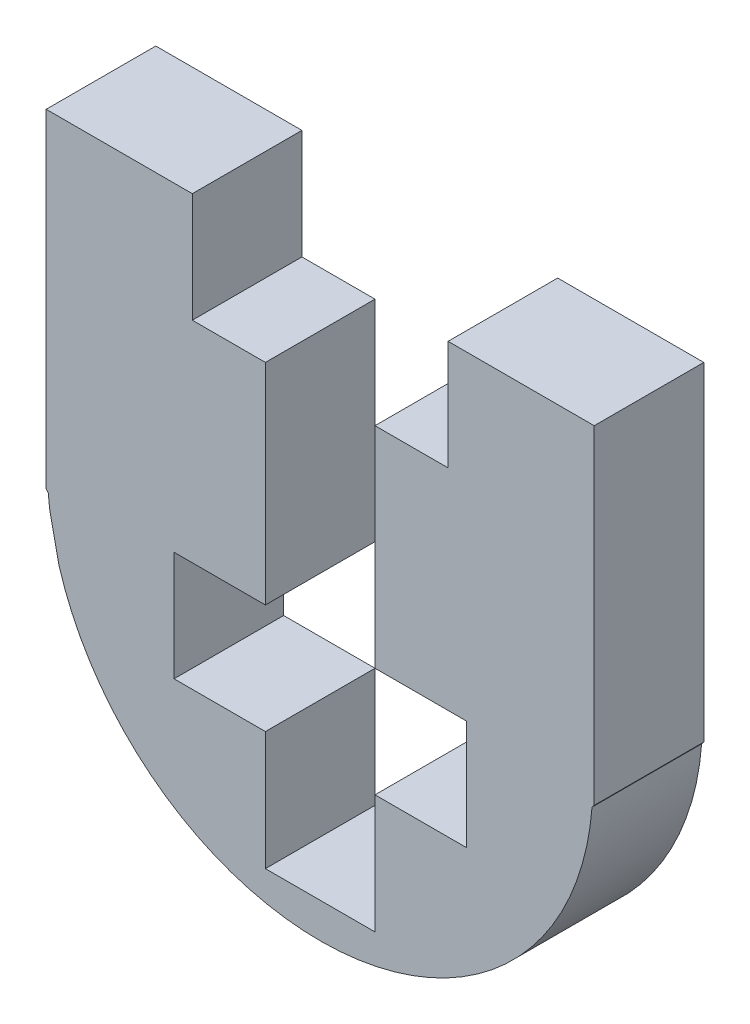
ISO-10303-21;
HEADER;
FILE_DESCRIPTION(('STEP AP214'),'2;1');
FILE_NAME('part.step','',(''),(''),'','','');
FILE_SCHEMA(('AUTOMOTIVE_DESIGN { 1 0 10303 214 1 1 1 1 }'));
ENDSEC;
DATA;
#1=APPLICATION_CONTEXT('core data for automotive mechanical design processes');
#2=APPLICATION_PROTOCOL_DEFINITION('international standard','automotive_design',2000,#1);
#3=PRODUCT_CONTEXT('',#1,'mechanical');
#4=PRODUCT('Part','Part','',(#3));
#5=PRODUCT_RELATED_PRODUCT_CATEGORY('part','',(#4));
#6=PRODUCT_DEFINITION_FORMATION('','',#4);
#7=PRODUCT_DEFINITION_CONTEXT('part definition',#1,'design');
#8=PRODUCT_DEFINITION('design','',#6,#7);
#9=PRODUCT_DEFINITION_SHAPE('','',#8);
#10=(LENGTH_UNIT() NAMED_UNIT(*) SI_UNIT(.MILLI.,.METRE.));
#11=(NAMED_UNIT(*) PLANE_ANGLE_UNIT() SI_UNIT($,.RADIAN.));
#12=(NAMED_UNIT(*) SI_UNIT($,.STERADIAN.) SOLID_ANGLE_UNIT());
#13=UNCERTAINTY_MEASURE_WITH_UNIT(LENGTH_MEASURE(1.E-05),#10,'distance_accuracy_value','');
#14=(GEOMETRIC_REPRESENTATION_CONTEXT(3) GLOBAL_UNCERTAINTY_ASSIGNED_CONTEXT((#13)) GLOBAL_UNIT_ASSIGNED_CONTEXT((#10,
#11,#12)) REPRESENTATION_CONTEXT('',''));
#15=CARTESIAN_POINT('',(0.,0.,0.));
#16=DIRECTION('',(0.,0.,1.));
#17=DIRECTION('',(1.,0.,0.));
#18=AXIS2_PLACEMENT_3D('',#15,#16,#17);
#19=CARTESIAN_POINT('',(-7.5,8.5,3.));
#20=DIRECTION('',(0.,-1.,0.));
#21=DIRECTION('',(1.,0.,0.));
#22=AXIS2_PLACEMENT_3D('',#19,#20,#21);
#23=PLANE('',#22);
#24=DIRECTION('',(-1.,0.,0.));
#25=VECTOR('',#24,1.);
#26=CARTESIAN_POINT('',(-7.5,8.5,3.));
#27=LINE('',#26,#25);
#28=CARTESIAN_POINT('',(-3.5,8.5,3.));
#29=VERTEX_POINT('',#28);
#30=CARTESIAN_POINT('',(-7.5,8.5,3.));
#31=VERTEX_POINT('',#30);
#32=EDGE_CURVE('E427',#29,#31,#27,.T.);
#33=ORIENTED_EDGE('',*,*,#32,.F.);
#34=DIRECTION('',(0.,0.,1.));
#35=VECTOR('',#34,1.);
#36=CARTESIAN_POINT('',(-3.5,8.5,-7.));
#37=LINE('',#36,#35);
#38=CARTESIAN_POINT('',(-3.5,8.5,0.));
#39=VERTEX_POINT('',#38);
#40=EDGE_CURVE('E359',#39,#29,#37,.T.);
#41=ORIENTED_EDGE('',*,*,#40,.F.);
#42=DIRECTION('',(-1.,0.,0.));
#43=VECTOR('',#42,1.);
#44=CARTESIAN_POINT('',(-7.5,8.5,0.));
#45=LINE('',#44,#43);
#46=CARTESIAN_POINT('',(-7.5,8.5,0.));
#47=VERTEX_POINT('',#46);
#48=EDGE_CURVE('E266',#39,#47,#45,.T.);
#49=ORIENTED_EDGE('',*,*,#48,.T.);
#50=DIRECTION('',(0.,0.,-1.));
#51=VECTOR('',#50,1.);
#52=CARTESIAN_POINT('',(-7.5,8.5,3.));
#53=LINE('',#52,#51);
#54=EDGE_CURVE('E278',#31,#47,#53,.T.);
#55=ORIENTED_EDGE('',*,*,#54,.F.);
#56=EDGE_LOOP('',(#33,#41,#49,#55));
#57=FACE_BOUND('',#56,.T.);
#58=ADVANCED_FACE('F67',(#57),#23,.F.);
#59=CARTESIAN_POINT('',(7.5,-0.500000000000001,3.));
#60=DIRECTION('',(-1.,0.,0.));
#61=DIRECTION('',(0.,-1.,0.));
#62=AXIS2_PLACEMENT_3D('',#59,#60,#61);
#63=PLANE('',#62);
#64=DIRECTION('',(0.,1.,0.));
#65=VECTOR('',#64,1.);
#66=CARTESIAN_POINT('',(7.5,-0.500000000000001,0.));
#67=LINE('',#66,#65);
#68=CARTESIAN_POINT('',(7.5,-0.500000000000001,0.));
#69=VERTEX_POINT('',#68);
#70=CARTESIAN_POINT('',(7.5,8.50000000000001,0.));
#71=VERTEX_POINT('',#70);
#72=EDGE_CURVE('E263',#69,#71,#67,.T.);
#73=ORIENTED_EDGE('',*,*,#72,.T.);
#74=DIRECTION('',(0.,0.,-1.));
#75=VECTOR('',#74,1.);
#76=CARTESIAN_POINT('',(7.5,8.50000000000001,3.));
#77=LINE('',#76,#75);
#78=CARTESIAN_POINT('',(7.5,8.50000000000001,3.));
#79=VERTEX_POINT('',#78);
#80=EDGE_CURVE('E281',#79,#71,#77,.T.);
#81=ORIENTED_EDGE('',*,*,#80,.F.);
#82=DIRECTION('',(0.,1.,0.));
#83=VECTOR('',#82,1.);
#84=CARTESIAN_POINT('',(7.5,-0.500000000000001,3.));
#85=LINE('',#84,#83);
#86=CARTESIAN_POINT('',(7.5,-0.500000000000001,3.));
#87=VERTEX_POINT('',#86);
#88=EDGE_CURVE('E275',#87,#79,#85,.T.);
#89=ORIENTED_EDGE('',*,*,#88,.F.);
#90=DIRECTION('',(0.,0.,-1.));
#91=VECTOR('',#90,1.);
#92=CARTESIAN_POINT('',(7.5,-0.500000000000001,3.));
#93=LINE('',#92,#91);
#94=EDGE_CURVE('E253',#87,#69,#93,.T.);
#95=ORIENTED_EDGE('',*,*,#94,.T.);
#96=EDGE_LOOP('',(#73,#81,#89,#95));
#97=FACE_BOUND('',#96,.T.);
#98=ADVANCED_FACE('F69',(#97),#63,.F.);
#99=CARTESIAN_POINT('',(3.5,8.5,0.));
#100=VERTEX_POINT('',#99);
#101=EDGE_CURVE('E268',#71,#100,#45,.T.);
#102=ORIENTED_EDGE('',*,*,#101,.T.);
#103=DIRECTION('',(0.,0.,1.));
#104=VECTOR('',#103,1.);
#105=CARTESIAN_POINT('',(3.5,8.5,-7.));
#106=LINE('',#105,#104);
#107=CARTESIAN_POINT('',(3.5,8.5,3.));
#108=VERTEX_POINT('',#107);
#109=EDGE_CURVE('E332',#100,#108,#106,.T.);
#110=ORIENTED_EDGE('',*,*,#109,.T.);
#111=EDGE_CURVE('E335',#79,#108,#27,.T.);
#112=ORIENTED_EDGE('',*,*,#111,.F.);
#113=ORIENTED_EDGE('',*,*,#80,.T.);
#114=EDGE_LOOP('',(#102,#110,#112,#113));
#115=FACE_BOUND('',#114,.T.);
#116=ADVANCED_FACE('F331',(#115),#23,.F.);
#117=CARTESIAN_POINT('',(-7.5,-0.500000000000001,3.));
#118=DIRECTION('',(1.,0.,0.));
#119=DIRECTION('',(0.,0.,-1.));
#120=AXIS2_PLACEMENT_3D('',#117,#118,#119);
#121=PLANE('',#120);
#122=DIRECTION('',(0.,-1.,0.));
#123=VECTOR('',#122,1.);
#124=CARTESIAN_POINT('',(-7.5,-0.500000000000001,0.));
#125=LINE('',#124,#123);
#126=CARTESIAN_POINT('',(-7.5,-0.500000000000001,0.));
#127=VERTEX_POINT('',#126);
#128=EDGE_CURVE('E271',#47,#127,#125,.T.);
#129=ORIENTED_EDGE('',*,*,#128,.T.);
#130=DIRECTION('',(0.,0.,-1.));
#131=VECTOR('',#130,1.);
#132=CARTESIAN_POINT('',(-7.5,-0.500000000000001,3.));
#133=LINE('',#132,#131);
#134=CARTESIAN_POINT('',(-7.5,-0.500000000000001,3.));
#135=VERTEX_POINT('',#134);
#136=EDGE_CURVE('E257',#135,#127,#133,.T.);
#137=ORIENTED_EDGE('',*,*,#136,.F.);
#138=DIRECTION('',(0.,-1.,0.));
#139=VECTOR('',#138,1.);
#140=CARTESIAN_POINT('',(-7.5,-0.500000000000001,3.));
#141=LINE('',#140,#139);
#142=EDGE_CURVE('E259',#31,#135,#141,.T.);
#143=ORIENTED_EDGE('',*,*,#142,.F.);
#144=ORIENTED_EDGE('',*,*,#54,.T.);
#145=EDGE_LOOP('',(#129,#137,#143,#144));
#146=FACE_BOUND('',#145,.T.);
#147=ADVANCED_FACE('F435',(#146),#121,.F.);
#148=CARTESIAN_POINT('',(-5.,-3.5,3.));
#149=DIRECTION('',(0.768221279597376,0.64018439966448,0.));
#150=DIRECTION('',(-0.64018439966448,0.768221279597376,0.));
#151=AXIS2_PLACEMENT_3D('',#148,#149,#150);
#152=PLANE('',#151);
#153=DIRECTION('',(0.64018439966448,-0.768221279597376,0.));
#154=VECTOR('',#153,1.);
#155=CARTESIAN_POINT('',(-5.,-3.5,0.));
#156=LINE('',#155,#154);
#157=CARTESIAN_POINT('',(-7.44050244554594,-0.571397065344873,0.));
#158=VERTEX_POINT('',#157);
#159=EDGE_CURVE('E87',#127,#158,#156,.T.);
#160=ORIENTED_EDGE('',*,*,#159,.T.);
#161=DIRECTION('',(0.,0.,1.));
#162=VECTOR('',#161,1.);
#163=CARTESIAN_POINT('',(-7.44050244554594,-0.571397065344871,0.));
#164=LINE('',#163,#162);
#165=CARTESIAN_POINT('',(-7.44050244554594,-0.571397065344873,3.));
#166=VERTEX_POINT('',#165);
#167=EDGE_CURVE('E82',#158,#166,#164,.T.);
#168=ORIENTED_EDGE('',*,*,#167,.T.);
#169=DIRECTION('',(0.64018439966448,-0.768221279597376,0.));
#170=VECTOR('',#169,1.);
#171=CARTESIAN_POINT('',(-5.,-3.5,3.));
#172=LINE('',#171,#170);
#173=EDGE_CURVE('E255',#135,#166,#172,.T.);
#174=ORIENTED_EDGE('',*,*,#173,.F.);
#175=ORIENTED_EDGE('',*,*,#136,.T.);
#176=EDGE_LOOP('',(#160,#168,#174,#175));
#177=FACE_BOUND('',#176,.T.);
#178=ADVANCED_FACE('F437',(#177),#152,.F.);
#179=CARTESIAN_POINT('',(5.,-3.5,3.));
#180=DIRECTION('',(-0.768221279597376,0.640184399664479,0.));
#181=DIRECTION('',(-0.640184399664479,-0.768221279597376,0.));
#182=AXIS2_PLACEMENT_3D('',#179,#180,#181);
#183=PLANE('',#182);
#184=DIRECTION('',(0.640184399664479,0.768221279597376,0.));
#185=VECTOR('',#184,1.);
#186=CARTESIAN_POINT('',(5.,-3.5,3.));
#187=LINE('',#186,#185);
#188=CARTESIAN_POINT('',(7.44050244554594,-0.571397065344866,3.));
#189=VERTEX_POINT('',#188);
#190=EDGE_CURVE('E234',#189,#87,#187,.T.);
#191=ORIENTED_EDGE('',*,*,#190,.F.);
#192=DIRECTION('',(0.,0.,1.));
#193=VECTOR('',#192,1.);
#194=CARTESIAN_POINT('',(7.44050244554594,-0.571397065344866,0.));
#195=LINE('',#194,#193);
#196=CARTESIAN_POINT('',(7.44050244554594,-0.571397065344866,0.));
#197=VERTEX_POINT('',#196);
#198=EDGE_CURVE('E244',#197,#189,#195,.T.);
#199=ORIENTED_EDGE('',*,*,#198,.F.);
#200=DIRECTION('',(0.640184399664479,0.768221279597376,0.));
#201=VECTOR('',#200,1.);
#202=CARTESIAN_POINT('',(5.,-3.5,0.));
#203=LINE('',#202,#201);
#204=EDGE_CURVE('E274',#197,#69,#203,.T.);
#205=ORIENTED_EDGE('',*,*,#204,.T.);
#206=ORIENTED_EDGE('',*,*,#94,.F.);
#207=EDGE_LOOP('',(#191,#199,#205,#206));
#208=FACE_BOUND('',#207,.T.);
#209=ADVANCED_FACE('F251',(#208),#183,.F.);
#210=CARTESIAN_POINT('',(0.,-4.46241055212455,3.));
#211=DIRECTION('',(0.,0.,1.));
#212=DIRECTION('',(1.,0.,0.));
#213=AXIS2_PLACEMENT_3D('',#210,#211,#212);
#214=PLANE('',#213);
#215=DIRECTION('',(1.,0.,0.));
#216=VECTOR('',#215,1.);
#217=CARTESIAN_POINT('',(-1.5,5.5,3.));
#218=LINE('',#217,#216);
#219=CARTESIAN_POINT('',(-3.5,5.5,3.));
#220=VERTEX_POINT('',#219);
#221=CARTESIAN_POINT('',(-1.5,5.5,3.));
#222=VERTEX_POINT('',#221);
#223=EDGE_CURVE('E357',#220,#222,#218,.T.);
#224=ORIENTED_EDGE('',*,*,#223,.F.);
#225=DIRECTION('',(0.,-1.,0.));
#226=VECTOR('',#225,1.);
#227=CARTESIAN_POINT('',(-3.5,8.5,3.));
#228=LINE('',#227,#226);
#229=EDGE_CURVE('E354',#29,#220,#228,.T.);
#230=ORIENTED_EDGE('',*,*,#229,.F.);
#231=ORIENTED_EDGE('',*,*,#32,.T.);
#232=ORIENTED_EDGE('',*,*,#142,.T.);
#233=ORIENTED_EDGE('',*,*,#173,.T.);
#234=CARTESIAN_POINT('',(0.,0.,3.));
#235=DIRECTION('',(0.,0.,1.));
#236=DIRECTION('',(1.,0.,0.));
#237=AXIS2_PLACEMENT_3D('',#234,#235,#236);
#238=CIRCLE('',#237,7.46241055212455);
#239=CARTESIAN_POINT('',(-7.3989350896553,-0.971252175043861,3.));
#240=VERTEX_POINT('',#239);
#241=EDGE_CURVE('E242',#166,#240,#238,.T.);
#242=ORIENTED_EDGE('',*,*,#241,.T.);
#243=DIRECTION('',(0.209692350271931,-0.977767415205392,0.));
#244=VECTOR('',#243,1.);
#245=CARTESIAN_POINT('',(-7.27273356043762,-1.55971304573425,3.));
#246=LINE('',#245,#244);
#247=CARTESIAN_POINT('',(-7.14653203121994,-2.14817391642467,3.));
#248=VERTEX_POINT('',#247);
#249=EDGE_CURVE('E238',#240,#248,#246,.T.);
#250=ORIENTED_EDGE('',*,*,#249,.T.);
#251=EDGE_CURVE('E228',#248,#189,#238,.T.);
#252=ORIENTED_EDGE('',*,*,#251,.T.);
#253=ORIENTED_EDGE('',*,*,#190,.T.);
#254=ORIENTED_EDGE('',*,*,#88,.T.);
#255=ORIENTED_EDGE('',*,*,#111,.T.);
#256=DIRECTION('',(0.,1.,0.));
#257=VECTOR('',#256,1.);
#258=CARTESIAN_POINT('',(3.5,8.5,3.));
#259=LINE('',#258,#257);
#260=CARTESIAN_POINT('',(3.5,5.5,3.));
#261=VERTEX_POINT('',#260);
#262=EDGE_CURVE('E365',#261,#108,#259,.T.);
#263=ORIENTED_EDGE('',*,*,#262,.F.);
#264=DIRECTION('',(1.,0.,0.));
#265=VECTOR('',#264,1.);
#266=CARTESIAN_POINT('',(1.5,5.5,3.));
#267=LINE('',#266,#265);
#268=CARTESIAN_POINT('',(1.5,5.5,3.));
#269=VERTEX_POINT('',#268);
#270=EDGE_CURVE('E351',#269,#261,#267,.T.);
#271=ORIENTED_EDGE('',*,*,#270,.F.);
#272=DIRECTION('',(0.,1.,0.));
#273=VECTOR('',#272,1.);
#274=CARTESIAN_POINT('',(1.5,8.5,3.));
#275=LINE('',#274,#273);
#276=CARTESIAN_POINT('',(1.5,-0.249999999999999,3.));
#277=VERTEX_POINT('',#276);
#278=EDGE_CURVE('E386',#277,#269,#275,.T.);
#279=ORIENTED_EDGE('',*,*,#278,.F.);
#280=DIRECTION('',(-1.,0.,0.));
#281=VECTOR('',#280,1.);
#282=CARTESIAN_POINT('',(1.5,-0.249999999999999,3.));
#283=LINE('',#282,#281);
#284=CARTESIAN_POINT('',(4.,-0.249999999999998,3.));
#285=VERTEX_POINT('',#284);
#286=EDGE_CURVE('E383',#285,#277,#283,.T.);
#287=ORIENTED_EDGE('',*,*,#286,.F.);
#288=DIRECTION('',(0.,1.,0.));
#289=VECTOR('',#288,1.);
#290=CARTESIAN_POINT('',(4.,-0.249999999999998,3.));
#291=LINE('',#290,#289);
#292=CARTESIAN_POINT('',(4.,-3.25,3.));
#293=VERTEX_POINT('',#292);
#294=EDGE_CURVE('E380',#293,#285,#291,.T.);
#295=ORIENTED_EDGE('',*,*,#294,.F.);
#296=DIRECTION('',(1.,0.,0.));
#297=VECTOR('',#296,1.);
#298=CARTESIAN_POINT('',(4.,-3.25,3.));
#299=LINE('',#298,#297);
#300=CARTESIAN_POINT('',(1.5,-3.25,3.));
#301=VERTEX_POINT('',#300);
#302=EDGE_CURVE('E377',#301,#293,#299,.T.);
#303=ORIENTED_EDGE('',*,*,#302,.F.);
#304=DIRECTION('',(0.,1.,0.));
#305=VECTOR('',#304,1.);
#306=CARTESIAN_POINT('',(1.5,-3.25,3.));
#307=LINE('',#306,#305);
#308=CARTESIAN_POINT('',(1.5,-6.5,3.));
#309=VERTEX_POINT('',#308);
#310=EDGE_CURVE('E374',#309,#301,#307,.T.);
#311=ORIENTED_EDGE('',*,*,#310,.F.);
#312=DIRECTION('',(1.,0.,0.));
#313=VECTOR('',#312,1.);
#314=CARTESIAN_POINT('',(-1.5,-6.5,3.));
#315=LINE('',#314,#313);
#316=CARTESIAN_POINT('',(-1.5,-6.5,3.));
#317=VERTEX_POINT('',#316);
#318=EDGE_CURVE('E403',#317,#309,#315,.T.);
#319=ORIENTED_EDGE('',*,*,#318,.F.);
#320=DIRECTION('',(0.,-1.,0.));
#321=VECTOR('',#320,1.);
#322=CARTESIAN_POINT('',(-1.5,-3.25,3.));
#323=LINE('',#322,#321);
#324=CARTESIAN_POINT('',(-1.5,-3.25,3.));
#325=VERTEX_POINT('',#324);
#326=EDGE_CURVE('E400',#325,#317,#323,.T.);
#327=ORIENTED_EDGE('',*,*,#326,.F.);
#328=DIRECTION('',(1.,0.,0.));
#329=VECTOR('',#328,1.);
#330=CARTESIAN_POINT('',(-4.,-3.25,3.));
#331=LINE('',#330,#329);
#332=CARTESIAN_POINT('',(-4.,-3.25,3.));
#333=VERTEX_POINT('',#332);
#334=EDGE_CURVE('E397',#333,#325,#331,.T.);
#335=ORIENTED_EDGE('',*,*,#334,.F.);
#336=DIRECTION('',(0.,-1.,0.));
#337=VECTOR('',#336,1.);
#338=CARTESIAN_POINT('',(-4.,-0.249999999999999,3.));
#339=LINE('',#338,#337);
#340=CARTESIAN_POINT('',(-4.,-0.249999999999999,3.));
#341=VERTEX_POINT('',#340);
#342=EDGE_CURVE('E394',#341,#333,#339,.T.);
#343=ORIENTED_EDGE('',*,*,#342,.F.);
#344=DIRECTION('',(-1.,0.,0.));
#345=VECTOR('',#344,1.);
#346=CARTESIAN_POINT('',(-1.5,-0.249999999999999,3.));
#347=LINE('',#346,#345);
#348=CARTESIAN_POINT('',(-1.5,-0.249999999999999,3.));
#349=VERTEX_POINT('',#348);
#350=EDGE_CURVE('E391',#349,#341,#347,.T.);
#351=ORIENTED_EDGE('',*,*,#350,.F.);
#352=DIRECTION('',(0.,-1.,0.));
#353=VECTOR('',#352,1.);
#354=CARTESIAN_POINT('',(-1.5,8.5,3.));
#355=LINE('',#354,#353);
#356=EDGE_CURVE('E389',#222,#349,#355,.T.);
#357=ORIENTED_EDGE('',*,*,#356,.F.);
#358=EDGE_LOOP('',(#224,#230,#231,#232,#233,#242,#250,#252,#253,#254,#255,#263,#271,#279,#287,
#295,#303,#311,#319,#327,#335,#343,#351,#357));
#359=FACE_BOUND('',#358,.T.);
#360=ADVANCED_FACE('F231',(#359),#214,.T.);
#361=CARTESIAN_POINT('',(0.,-4.46241055212455,0.));
#362=DIRECTION('',(0.,0.,1.));
#363=DIRECTION('',(1.,0.,0.));
#364=AXIS2_PLACEMENT_3D('',#361,#362,#363);
#365=PLANE('',#364);
#366=DIRECTION('',(0.,-1.,0.));
#367=VECTOR('',#366,1.);
#368=CARTESIAN_POINT('',(-3.5,-4.46241055212455,0.));
#369=LINE('',#368,#367);
#370=CARTESIAN_POINT('',(-3.5,5.5,0.));
#371=VERTEX_POINT('',#370);
#372=EDGE_CURVE('E12',#39,#371,#369,.T.);
#373=ORIENTED_EDGE('',*,*,#372,.T.);
#374=DIRECTION('',(1.,0.,0.));
#375=VECTOR('',#374,1.);
#376=CARTESIAN_POINT('',(0.,5.5,0.));
#377=LINE('',#376,#375);
#378=CARTESIAN_POINT('',(-1.5,5.5,0.));
#379=VERTEX_POINT('',#378);
#380=EDGE_CURVE('E371',#371,#379,#377,.T.);
#381=ORIENTED_EDGE('',*,*,#380,.T.);
#382=DIRECTION('',(0.,-1.,0.));
#383=VECTOR('',#382,1.);
#384=CARTESIAN_POINT('',(-1.5,-4.46241055212455,0.));
#385=LINE('',#384,#383);
#386=CARTESIAN_POINT('',(-1.5,-0.249999999999999,0.));
#387=VERTEX_POINT('',#386);
#388=EDGE_CURVE('E314',#379,#387,#385,.T.);
#389=ORIENTED_EDGE('',*,*,#388,.T.);
#390=DIRECTION('',(-1.,0.,0.));
#391=VECTOR('',#390,1.);
#392=CARTESIAN_POINT('',(0.,-0.249999999999999,0.));
#393=LINE('',#392,#391);
#394=CARTESIAN_POINT('',(-4.,-0.249999999999999,0.));
#395=VERTEX_POINT('',#394);
#396=EDGE_CURVE('E311',#387,#395,#393,.T.);
#397=ORIENTED_EDGE('',*,*,#396,.T.);
#398=DIRECTION('',(0.,-1.,0.));
#399=VECTOR('',#398,1.);
#400=CARTESIAN_POINT('',(-4.,-4.46241055212455,0.));
#401=LINE('',#400,#399);
#402=CARTESIAN_POINT('',(-4.,-3.25,0.));
#403=VERTEX_POINT('',#402);
#404=EDGE_CURVE('E308',#395,#403,#401,.T.);
#405=ORIENTED_EDGE('',*,*,#404,.T.);
#406=DIRECTION('',(1.,0.,0.));
#407=VECTOR('',#406,1.);
#408=CARTESIAN_POINT('',(0.,-3.25,0.));
#409=LINE('',#408,#407);
#410=CARTESIAN_POINT('',(-1.5,-3.25,0.));
#411=VERTEX_POINT('',#410);
#412=EDGE_CURVE('E305',#403,#411,#409,.T.);
#413=ORIENTED_EDGE('',*,*,#412,.T.);
#414=DIRECTION('',(0.,-1.,0.));
#415=VECTOR('',#414,1.);
#416=CARTESIAN_POINT('',(-1.5,-4.46241055212455,0.));
#417=LINE('',#416,#415);
#418=CARTESIAN_POINT('',(-1.5,-6.5,0.));
#419=VERTEX_POINT('',#418);
#420=EDGE_CURVE('E302',#411,#419,#417,.T.);
#421=ORIENTED_EDGE('',*,*,#420,.T.);
#422=DIRECTION('',(1.,0.,0.));
#423=VECTOR('',#422,1.);
#424=CARTESIAN_POINT('',(0.,-6.5,0.));
#425=LINE('',#424,#423);
#426=CARTESIAN_POINT('',(1.5,-6.5,0.));
#427=VERTEX_POINT('',#426);
#428=EDGE_CURVE('E299',#419,#427,#425,.T.);
#429=ORIENTED_EDGE('',*,*,#428,.T.);
#430=DIRECTION('',(0.,1.,0.));
#431=VECTOR('',#430,1.);
#432=CARTESIAN_POINT('',(1.5,-4.46241055212455,0.));
#433=LINE('',#432,#431);
#434=CARTESIAN_POINT('',(1.5,-3.25,0.));
#435=VERTEX_POINT('',#434);
#436=EDGE_CURVE('E296',#427,#435,#433,.T.);
#437=ORIENTED_EDGE('',*,*,#436,.T.);
#438=DIRECTION('',(1.,0.,0.));
#439=VECTOR('',#438,1.);
#440=CARTESIAN_POINT('',(0.,-3.25,0.));
#441=LINE('',#440,#439);
#442=CARTESIAN_POINT('',(4.,-3.25,0.));
#443=VERTEX_POINT('',#442);
#444=EDGE_CURVE('E284',#435,#443,#441,.T.);
#445=ORIENTED_EDGE('',*,*,#444,.T.);
#446=DIRECTION('',(0.,1.,0.));
#447=VECTOR('',#446,1.);
#448=CARTESIAN_POINT('',(4.00000000000001,-4.46241055212455,0.));
#449=LINE('',#448,#447);
#450=CARTESIAN_POINT('',(4.,-0.249999999999998,0.));
#451=VERTEX_POINT('',#450);
#452=EDGE_CURVE('E287',#443,#451,#449,.T.);
#453=ORIENTED_EDGE('',*,*,#452,.T.);
#454=DIRECTION('',(-1.,0.,0.));
#455=VECTOR('',#454,1.);
#456=CARTESIAN_POINT('',(0.,-0.249999999999999,0.));
#457=LINE('',#456,#455);
#458=CARTESIAN_POINT('',(1.5,-0.249999999999999,0.));
#459=VERTEX_POINT('',#458);
#460=EDGE_CURVE('E290',#451,#459,#457,.T.);
#461=ORIENTED_EDGE('',*,*,#460,.T.);
#462=DIRECTION('',(0.,1.,0.));
#463=VECTOR('',#462,1.);
#464=CARTESIAN_POINT('',(1.5,-4.46241055212455,0.));
#465=LINE('',#464,#463);
#466=CARTESIAN_POINT('',(1.5,5.5,0.));
#467=VERTEX_POINT('',#466);
#468=EDGE_CURVE('E293',#459,#467,#465,.T.);
#469=ORIENTED_EDGE('',*,*,#468,.T.);
#470=DIRECTION('',(1.,0.,0.));
#471=VECTOR('',#470,1.);
#472=CARTESIAN_POINT('',(0.,5.5,0.));
#473=LINE('',#472,#471);
#474=CARTESIAN_POINT('',(3.5,5.5,0.));
#475=VERTEX_POINT('',#474);
#476=EDGE_CURVE('E326',#467,#475,#473,.T.);
#477=ORIENTED_EDGE('',*,*,#476,.T.);
#478=DIRECTION('',(0.,1.,0.));
#479=VECTOR('',#478,1.);
#480=CARTESIAN_POINT('',(3.5,-4.46241055212455,0.));
#481=LINE('',#480,#479);
#482=EDGE_CURVE('E75',#475,#100,#481,.T.);
#483=ORIENTED_EDGE('',*,*,#482,.T.);
#484=ORIENTED_EDGE('',*,*,#101,.F.);
#485=ORIENTED_EDGE('',*,*,#72,.F.);
#486=ORIENTED_EDGE('',*,*,#204,.F.);
#487=CARTESIAN_POINT('',(0.,0.,0.));
#488=DIRECTION('',(0.,0.,1.));
#489=DIRECTION('',(1.,0.,0.));
#490=AXIS2_PLACEMENT_3D('',#487,#488,#489);
#491=CIRCLE('',#490,7.46241055212455);
#492=CARTESIAN_POINT('',(-7.14653203121994,-2.14817391642467,0.));
#493=VERTEX_POINT('',#492);
#494=EDGE_CURVE('E247',#493,#197,#491,.T.);
#495=ORIENTED_EDGE('',*,*,#494,.F.);
#496=DIRECTION('',(0.209692350271931,-0.977767415205392,0.));
#497=VECTOR('',#496,1.);
#498=CARTESIAN_POINT('',(-7.27273356043762,-1.55971304573425,0.));
#499=LINE('',#498,#497);
#500=CARTESIAN_POINT('',(-7.3989350896553,-0.971252175043861,0.));
#501=VERTEX_POINT('',#500);
#502=EDGE_CURVE('E340',#501,#493,#499,.T.);
#503=ORIENTED_EDGE('',*,*,#502,.F.);
#504=EDGE_CURVE('E240',#158,#501,#491,.T.);
#505=ORIENTED_EDGE('',*,*,#504,.F.);
#506=ORIENTED_EDGE('',*,*,#159,.F.);
#507=ORIENTED_EDGE('',*,*,#128,.F.);
#508=ORIENTED_EDGE('',*,*,#48,.F.);
#509=EDGE_LOOP('',(#373,#381,#389,#397,#405,#413,#421,#429,#437,#445,#453,#461,#469,#477,#483,
#484,#485,#486,#495,#503,#505,#506,#507,#508));
#510=FACE_BOUND('',#509,.T.);
#511=ADVANCED_FACE('F324',(#510),#365,.F.);
#512=CARTESIAN_POINT('',(1.5,-3.25,-7.));
#513=DIRECTION('',(1.,0.,0.));
#514=DIRECTION('',(0.,1.,0.));
#515=AXIS2_PLACEMENT_3D('',#512,#513,#514);
#516=PLANE('',#515);
#517=DIRECTION('',(0.,0.,1.));
#518=VECTOR('',#517,1.);
#519=CARTESIAN_POINT('',(1.5,-6.5,-7.));
#520=LINE('',#519,#518);
#521=EDGE_CURVE('E267',#427,#309,#520,.T.);
#522=ORIENTED_EDGE('',*,*,#521,.T.);
#523=ORIENTED_EDGE('',*,*,#310,.T.);
#524=DIRECTION('',(0.,0.,1.));
#525=VECTOR('',#524,1.);
#526=CARTESIAN_POINT('',(1.5,-3.25,-7.));
#527=LINE('',#526,#525);
#528=EDGE_CURVE('E406',#435,#301,#527,.T.);
#529=ORIENTED_EDGE('',*,*,#528,.F.);
#530=ORIENTED_EDGE('',*,*,#436,.F.);
#531=EDGE_LOOP('',(#522,#523,#529,#530));
#532=FACE_BOUND('',#531,.T.);
#533=ADVANCED_FACE('F469',(#532),#516,.F.);
#534=CARTESIAN_POINT('',(-1.5,-6.5,-7.));
#535=DIRECTION('',(0.,-1.,0.));
#536=DIRECTION('',(0.,0.,-1.));
#537=AXIS2_PLACEMENT_3D('',#534,#535,#536);
#538=PLANE('',#537);
#539=DIRECTION('',(0.,0.,1.));
#540=VECTOR('',#539,1.);
#541=CARTESIAN_POINT('',(-1.5,-6.5,-7.));
#542=LINE('',#541,#540);
#543=EDGE_CURVE('E408',#419,#317,#542,.T.);
#544=ORIENTED_EDGE('',*,*,#543,.T.);
#545=ORIENTED_EDGE('',*,*,#318,.T.);
#546=ORIENTED_EDGE('',*,*,#521,.F.);
#547=ORIENTED_EDGE('',*,*,#428,.F.);
#548=EDGE_LOOP('',(#544,#545,#546,#547));
#549=FACE_BOUND('',#548,.T.);
#550=ADVANCED_FACE('F474',(#549),#538,.F.);
#551=CARTESIAN_POINT('',(-1.5,-3.25,-7.));
#552=DIRECTION('',(-1.,0.,0.));
#553=DIRECTION('',(0.,-1.,0.));
#554=AXIS2_PLACEMENT_3D('',#551,#552,#553);
#555=PLANE('',#554);
#556=DIRECTION('',(0.,0.,1.));
#557=VECTOR('',#556,1.);
#558=CARTESIAN_POINT('',(-1.5,-3.25,-7.));
#559=LINE('',#558,#557);
#560=EDGE_CURVE('E410',#411,#325,#559,.T.);
#561=ORIENTED_EDGE('',*,*,#560,.T.);
#562=ORIENTED_EDGE('',*,*,#326,.T.);
#563=ORIENTED_EDGE('',*,*,#543,.F.);
#564=ORIENTED_EDGE('',*,*,#420,.F.);
#565=EDGE_LOOP('',(#561,#562,#563,#564));
#566=FACE_BOUND('',#565,.T.);
#567=ADVANCED_FACE('F486',(#566),#555,.F.);
#568=CARTESIAN_POINT('',(-4.,-3.25,-7.));
#569=DIRECTION('',(0.,-1.,0.));
#570=DIRECTION('',(1.,0.,0.));
#571=AXIS2_PLACEMENT_3D('',#568,#569,#570);
#572=PLANE('',#571);
#573=DIRECTION('',(0.,0.,1.));
#574=VECTOR('',#573,1.);
#575=CARTESIAN_POINT('',(-4.,-3.25,-7.));
#576=LINE('',#575,#574);
#577=EDGE_CURVE('E412',#403,#333,#576,.T.);
#578=ORIENTED_EDGE('',*,*,#577,.T.);
#579=ORIENTED_EDGE('',*,*,#334,.T.);
#580=ORIENTED_EDGE('',*,*,#560,.F.);
#581=ORIENTED_EDGE('',*,*,#412,.F.);
#582=EDGE_LOOP('',(#578,#579,#580,#581));
#583=FACE_BOUND('',#582,.T.);
#584=ADVANCED_FACE('F496',(#583),#572,.F.);
#585=CARTESIAN_POINT('',(-4.,-0.249999999999999,-7.));
#586=DIRECTION('',(-1.,0.,0.));
#587=DIRECTION('',(0.,-1.,0.));
#588=AXIS2_PLACEMENT_3D('',#585,#586,#587);
#589=PLANE('',#588);
#590=DIRECTION('',(0.,0.,1.));
#591=VECTOR('',#590,1.);
#592=CARTESIAN_POINT('',(-4.,-0.249999999999999,-7.));
#593=LINE('',#592,#591);
#594=EDGE_CURVE('E414',#395,#341,#593,.T.);
#595=ORIENTED_EDGE('',*,*,#594,.T.);
#596=ORIENTED_EDGE('',*,*,#342,.T.);
#597=ORIENTED_EDGE('',*,*,#577,.F.);
#598=ORIENTED_EDGE('',*,*,#404,.F.);
#599=EDGE_LOOP('',(#595,#596,#597,#598));
#600=FACE_BOUND('',#599,.T.);
#601=ADVANCED_FACE('F506',(#600),#589,.F.);
#602=CARTESIAN_POINT('',(-1.5,-0.249999999999999,-7.));
#603=DIRECTION('',(0.,1.,0.));
#604=DIRECTION('',(0.,0.,1.));
#605=AXIS2_PLACEMENT_3D('',#602,#603,#604);
#606=PLANE('',#605);
#607=DIRECTION('',(0.,0.,1.));
#608=VECTOR('',#607,1.);
#609=CARTESIAN_POINT('',(-1.5,-0.249999999999999,-7.));
#610=LINE('',#609,#608);
#611=EDGE_CURVE('E416',#387,#349,#610,.T.);
#612=ORIENTED_EDGE('',*,*,#611,.T.);
#613=ORIENTED_EDGE('',*,*,#350,.T.);
#614=ORIENTED_EDGE('',*,*,#594,.F.);
#615=ORIENTED_EDGE('',*,*,#396,.F.);
#616=EDGE_LOOP('',(#612,#613,#614,#615));
#617=FACE_BOUND('',#616,.T.);
#618=ADVANCED_FACE('F516',(#617),#606,.F.);
#619=CARTESIAN_POINT('',(-1.5,8.5,-7.));
#620=DIRECTION('',(-1.,0.,0.));
#621=DIRECTION('',(0.,-1.,0.));
#622=AXIS2_PLACEMENT_3D('',#619,#620,#621);
#623=PLANE('',#622);
#624=ORIENTED_EDGE('',*,*,#388,.F.);
#625=DIRECTION('',(0.,0.,1.));
#626=VECTOR('',#625,1.);
#627=CARTESIAN_POINT('',(-1.5,5.5,-7.));
#628=LINE('',#627,#626);
#629=EDGE_CURVE('E319',#379,#222,#628,.T.);
#630=ORIENTED_EDGE('',*,*,#629,.T.);
#631=ORIENTED_EDGE('',*,*,#356,.T.);
#632=ORIENTED_EDGE('',*,*,#611,.F.);
#633=EDGE_LOOP('',(#624,#630,#631,#632));
#634=FACE_BOUND('',#633,.T.);
#635=ADVANCED_FACE('F526',(#634),#623,.F.);
#636=CARTESIAN_POINT('',(1.5,8.5,-7.));
#637=DIRECTION('',(1.,0.,0.));
#638=DIRECTION('',(0.,1.,0.));
#639=AXIS2_PLACEMENT_3D('',#636,#637,#638);
#640=PLANE('',#639);
#641=ORIENTED_EDGE('',*,*,#278,.T.);
#642=DIRECTION('',(0.,0.,-1.));
#643=VECTOR('',#642,1.);
#644=CARTESIAN_POINT('',(1.5,5.5,-7.));
#645=LINE('',#644,#643);
#646=EDGE_CURVE('E316',#269,#467,#645,.T.);
#647=ORIENTED_EDGE('',*,*,#646,.T.);
#648=ORIENTED_EDGE('',*,*,#468,.F.);
#649=DIRECTION('',(0.,0.,1.));
#650=VECTOR('',#649,1.);
#651=CARTESIAN_POINT('',(1.5,-0.249999999999999,-7.));
#652=LINE('',#651,#650);
#653=EDGE_CURVE('E419',#459,#277,#652,.T.);
#654=ORIENTED_EDGE('',*,*,#653,.T.);
#655=EDGE_LOOP('',(#641,#647,#648,#654));
#656=FACE_BOUND('',#655,.T.);
#657=ADVANCED_FACE('F540',(#656),#640,.F.);
#658=CARTESIAN_POINT('',(1.5,-0.249999999999999,-7.));
#659=DIRECTION('',(0.,1.,0.));
#660=DIRECTION('',(-1.,0.,0.));
#661=AXIS2_PLACEMENT_3D('',#658,#659,#660);
#662=PLANE('',#661);
#663=DIRECTION('',(0.,0.,1.));
#664=VECTOR('',#663,1.);
#665=CARTESIAN_POINT('',(4.,-0.249999999999998,-7.));
#666=LINE('',#665,#664);
#667=EDGE_CURVE('E421',#451,#285,#666,.T.);
#668=ORIENTED_EDGE('',*,*,#667,.T.);
#669=ORIENTED_EDGE('',*,*,#286,.T.);
#670=ORIENTED_EDGE('',*,*,#653,.F.);
#671=ORIENTED_EDGE('',*,*,#460,.F.);
#672=EDGE_LOOP('',(#668,#669,#670,#671));
#673=FACE_BOUND('',#672,.T.);
#674=ADVANCED_FACE('F534',(#673),#662,.F.);
#675=CARTESIAN_POINT('',(4.,-0.249999999999998,-7.));
#676=DIRECTION('',(1.,0.,0.));
#677=DIRECTION('',(0.,1.,0.));
#678=AXIS2_PLACEMENT_3D('',#675,#676,#677);
#679=PLANE('',#678);
#680=DIRECTION('',(0.,0.,1.));
#681=VECTOR('',#680,1.);
#682=CARTESIAN_POINT('',(4.,-3.25,-7.));
#683=LINE('',#682,#681);
#684=EDGE_CURVE('E423',#443,#293,#683,.T.);
#685=ORIENTED_EDGE('',*,*,#684,.T.);
#686=ORIENTED_EDGE('',*,*,#294,.T.);
#687=ORIENTED_EDGE('',*,*,#667,.F.);
#688=ORIENTED_EDGE('',*,*,#452,.F.);
#689=EDGE_LOOP('',(#685,#686,#687,#688));
#690=FACE_BOUND('',#689,.T.);
#691=ADVANCED_FACE('F539',(#690),#679,.F.);
#692=CARTESIAN_POINT('',(4.,-3.25,-7.));
#693=DIRECTION('',(0.,-1.,0.));
#694=DIRECTION('',(1.,0.,0.));
#695=AXIS2_PLACEMENT_3D('',#692,#693,#694);
#696=PLANE('',#695);
#697=ORIENTED_EDGE('',*,*,#528,.T.);
#698=ORIENTED_EDGE('',*,*,#302,.T.);
#699=ORIENTED_EDGE('',*,*,#684,.F.);
#700=ORIENTED_EDGE('',*,*,#444,.F.);
#701=EDGE_LOOP('',(#697,#698,#699,#700));
#702=FACE_BOUND('',#701,.T.);
#703=ADVANCED_FACE('F552',(#702),#696,.F.);
#704=CARTESIAN_POINT('',(3.5,8.5,-7.));
#705=DIRECTION('',(1.,0.,0.));
#706=DIRECTION('',(0.,1.,0.));
#707=AXIS2_PLACEMENT_3D('',#704,#705,#706);
#708=PLANE('',#707);
#709=DIRECTION('',(0.,0.,1.));
#710=VECTOR('',#709,1.);
#711=CARTESIAN_POINT('',(3.5,5.5,-7.));
#712=LINE('',#711,#710);
#713=EDGE_CURVE('E367',#475,#261,#712,.T.);
#714=ORIENTED_EDGE('',*,*,#713,.T.);
#715=ORIENTED_EDGE('',*,*,#262,.T.);
#716=ORIENTED_EDGE('',*,*,#109,.F.);
#717=ORIENTED_EDGE('',*,*,#482,.F.);
#718=EDGE_LOOP('',(#714,#715,#716,#717));
#719=FACE_BOUND('',#718,.T.);
#720=ADVANCED_FACE('F561',(#719),#708,.F.);
#721=CARTESIAN_POINT('',(1.5,5.5,-7.));
#722=DIRECTION('',(0.,-1.,0.));
#723=DIRECTION('',(1.,0.,0.));
#724=AXIS2_PLACEMENT_3D('',#721,#722,#723);
#725=PLANE('',#724);
#726=ORIENTED_EDGE('',*,*,#646,.F.);
#727=ORIENTED_EDGE('',*,*,#270,.T.);
#728=ORIENTED_EDGE('',*,*,#713,.F.);
#729=ORIENTED_EDGE('',*,*,#476,.F.);
#730=EDGE_LOOP('',(#726,#727,#728,#729));
#731=FACE_BOUND('',#730,.T.);
#732=ADVANCED_FACE('F615',(#731),#725,.F.);
#733=CARTESIAN_POINT('',(-3.5,8.5,-7.));
#734=DIRECTION('',(-1.,0.,0.));
#735=DIRECTION('',(0.,-1.,0.));
#736=AXIS2_PLACEMENT_3D('',#733,#734,#735);
#737=PLANE('',#736);
#738=ORIENTED_EDGE('',*,*,#40,.T.);
#739=ORIENTED_EDGE('',*,*,#229,.T.);
#740=DIRECTION('',(0.,0.,1.));
#741=VECTOR('',#740,1.);
#742=CARTESIAN_POINT('',(-3.5,5.5,-7.));
#743=LINE('',#742,#741);
#744=EDGE_CURVE('E360',#371,#220,#743,.T.);
#745=ORIENTED_EDGE('',*,*,#744,.F.);
#746=ORIENTED_EDGE('',*,*,#372,.F.);
#747=EDGE_LOOP('',(#738,#739,#745,#746));
#748=FACE_BOUND('',#747,.T.);
#749=ADVANCED_FACE('F604',(#748),#737,.F.);
#750=CARTESIAN_POINT('',(-1.5,5.5,-7.));
#751=DIRECTION('',(0.,-1.,0.));
#752=DIRECTION('',(1.,0.,0.));
#753=AXIS2_PLACEMENT_3D('',#750,#751,#752);
#754=PLANE('',#753);
#755=ORIENTED_EDGE('',*,*,#744,.T.);
#756=ORIENTED_EDGE('',*,*,#223,.T.);
#757=ORIENTED_EDGE('',*,*,#629,.F.);
#758=ORIENTED_EDGE('',*,*,#380,.F.);
#759=EDGE_LOOP('',(#755,#756,#757,#758));
#760=FACE_BOUND('',#759,.T.);
#761=ADVANCED_FACE('F600',(#760),#754,.F.);
#762=CARTESIAN_POINT('',(0.,0.,0.));
#763=DIRECTION('',(0.,0.,1.));
#764=DIRECTION('',(1.,0.,0.));
#765=AXIS2_PLACEMENT_3D('',#762,#763,#764);
#766=CYLINDRICAL_SURFACE('',#765,7.46241055212455);
#767=ORIENTED_EDGE('',*,*,#251,.F.);
#768=DIRECTION('',(0.,0.,1.));
#769=VECTOR('',#768,1.);
#770=CARTESIAN_POINT('',(-7.14653203121994,-2.14817391642467,0.));
#771=LINE('',#770,#769);
#772=EDGE_CURVE('E345',#493,#248,#771,.T.);
#773=ORIENTED_EDGE('',*,*,#772,.F.);
#774=ORIENTED_EDGE('',*,*,#494,.T.);
#775=ORIENTED_EDGE('',*,*,#198,.T.);
#776=EDGE_LOOP('',(#767,#773,#774,#775));
#777=FACE_BOUND('',#776,.T.);
#778=ADVANCED_FACE('F245',(#777),#766,.T.);
#779=CARTESIAN_POINT('',(-7.27273356043762,-1.55971304573425,0.));
#780=DIRECTION('',(-0.977767415205392,-0.20969235027193,0.));
#781=DIRECTION('',(0.209692350271931,-0.977767415205392,0.));
#782=AXIS2_PLACEMENT_3D('',#779,#780,#781);
#783=PLANE('',#782);
#784=ORIENTED_EDGE('',*,*,#249,.F.);
#785=DIRECTION('',(0.,0.,1.));
#786=VECTOR('',#785,1.);
#787=CARTESIAN_POINT('',(-7.3989350896553,-0.971252175043861,0.));
#788=LINE('',#787,#786);
#789=EDGE_CURVE('E346',#501,#240,#788,.T.);
#790=ORIENTED_EDGE('',*,*,#789,.F.);
#791=ORIENTED_EDGE('',*,*,#502,.T.);
#792=ORIENTED_EDGE('',*,*,#772,.T.);
#793=EDGE_LOOP('',(#784,#790,#791,#792));
#794=FACE_BOUND('',#793,.T.);
#795=ADVANCED_FACE('F344',(#794),#783,.T.);
#796=ORIENTED_EDGE('',*,*,#241,.F.);
#797=ORIENTED_EDGE('',*,*,#167,.F.);
#798=ORIENTED_EDGE('',*,*,#504,.T.);
#799=ORIENTED_EDGE('',*,*,#789,.T.);
#800=EDGE_LOOP('',(#796,#797,#798,#799));
#801=FACE_BOUND('',#800,.T.);
#802=ADVANCED_FACE('F652',(#801),#766,.T.);
#803=CLOSED_SHELL('',(#58,#98,#116,#147,#178,#209,#360,#511,#533,#550,#567,#584,#601,#618,#635,
#657,#674,#691,#703,#720,#732,#749,#761,#778,#795,#802));
#804=MANIFOLD_SOLID_BREP('B2',#803);
#805=ADVANCED_BREP_SHAPE_REPRESENTATION('',(#18,#804),#14);
#806=SHAPE_DEFINITION_REPRESENTATION(#9,#805);
ENDSEC;
END-ISO-10303-21;
